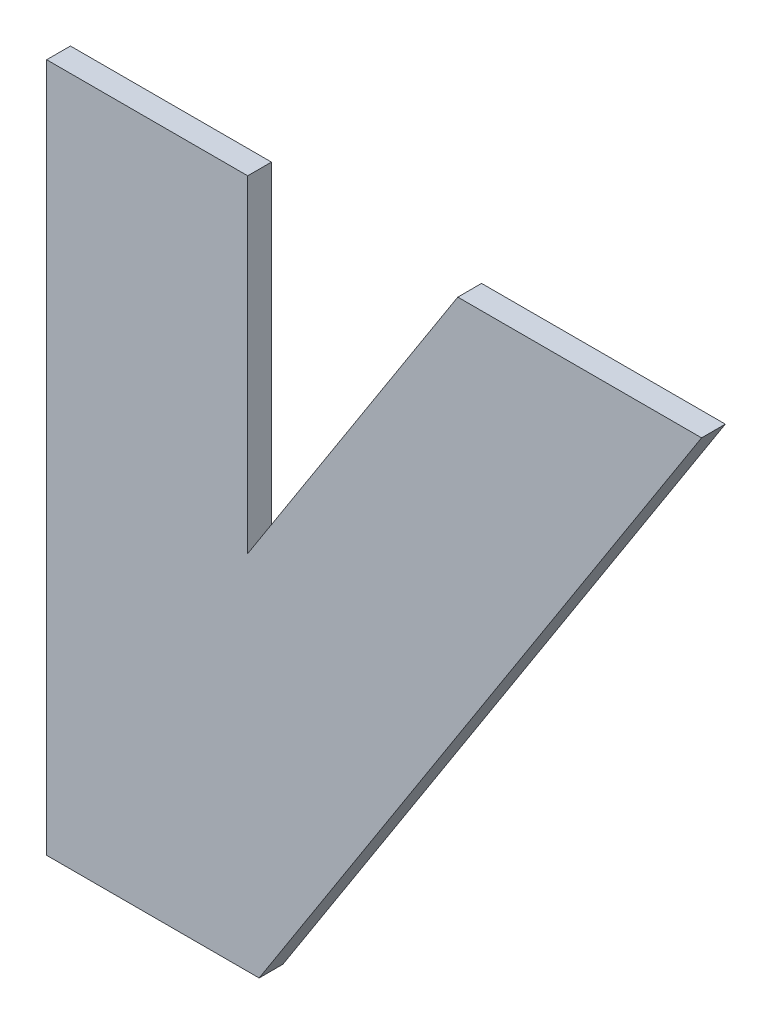
ISO-10303-21;
HEADER;
FILE_DESCRIPTION(('STEP AP214'),'2;1');
FILE_NAME('part.step','',(''),(''),'','','');
FILE_SCHEMA(('AUTOMOTIVE_DESIGN { 1 0 10303 214 1 1 1 1 }'));
ENDSEC;
DATA;
#1=APPLICATION_CONTEXT('core data for automotive mechanical design processes');
#2=APPLICATION_PROTOCOL_DEFINITION('international standard','automotive_design',2000,#1);
#3=PRODUCT_CONTEXT('',#1,'mechanical');
#4=PRODUCT('Part','Part','',(#3));
#5=PRODUCT_RELATED_PRODUCT_CATEGORY('part','',(#4));
#6=PRODUCT_DEFINITION_FORMATION('','',#4);
#7=PRODUCT_DEFINITION_CONTEXT('part definition',#1,'design');
#8=PRODUCT_DEFINITION('design','',#6,#7);
#9=PRODUCT_DEFINITION_SHAPE('','',#8);
#10=(LENGTH_UNIT() NAMED_UNIT(*) SI_UNIT(.MILLI.,.METRE.));
#11=(NAMED_UNIT(*) PLANE_ANGLE_UNIT() SI_UNIT($,.RADIAN.));
#12=(NAMED_UNIT(*) SI_UNIT($,.STERADIAN.) SOLID_ANGLE_UNIT());
#13=UNCERTAINTY_MEASURE_WITH_UNIT(LENGTH_MEASURE(1.E-05),#10,'distance_accuracy_value','');
#14=(GEOMETRIC_REPRESENTATION_CONTEXT(3) GLOBAL_UNCERTAINTY_ASSIGNED_CONTEXT((#13)) GLOBAL_UNIT_ASSIGNED_CONTEXT((#10,
#11,#12)) REPRESENTATION_CONTEXT('',''));
#15=CARTESIAN_POINT('',(0.,0.,0.));
#16=DIRECTION('',(0.,0.,1.));
#17=DIRECTION('',(1.,0.,0.));
#18=AXIS2_PLACEMENT_3D('',#15,#16,#17);
#19=CARTESIAN_POINT('',(-11.5384615384615,-15.,0.5));
#20=DIRECTION('',(0.,1.,0.));
#21=DIRECTION('',(0.,0.,1.));
#22=AXIS2_PLACEMENT_3D('',#19,#20,#21);
#23=PLANE('',#22);
#24=DIRECTION('',(1.,0.,0.));
#25=VECTOR('',#24,1.);
#26=CARTESIAN_POINT('',(-11.5384615384615,-15.,0.));
#27=LINE('',#26,#25);
#28=CARTESIAN_POINT('',(-11.5384615384615,-15.,0.));
#29=VERTEX_POINT('',#28);
#30=CARTESIAN_POINT('',(-7.06730769230767,-15.,0.));
#31=VERTEX_POINT('',#30);
#32=EDGE_CURVE('E140',#29,#31,#27,.T.);
#33=ORIENTED_EDGE('',*,*,#32,.T.);
#34=DIRECTION('',(0.,0.,-1.));
#35=VECTOR('',#34,1.);
#36=CARTESIAN_POINT('',(-7.06730769230767,-15.,0.5));
#37=LINE('',#36,#35);
#38=CARTESIAN_POINT('',(-7.06730769230767,-15.,0.5));
#39=VERTEX_POINT('',#38);
#40=EDGE_CURVE('E142',#39,#31,#37,.T.);
#41=ORIENTED_EDGE('',*,*,#40,.F.);
#42=DIRECTION('',(1.,0.,0.));
#43=VECTOR('',#42,1.);
#44=CARTESIAN_POINT('',(-11.5384615384615,-15.,0.5));
#45=LINE('',#44,#43);
#46=CARTESIAN_POINT('',(-11.5384615384615,-15.,0.5));
#47=VERTEX_POINT('',#46);
#48=EDGE_CURVE('E139',#47,#39,#45,.T.);
#49=ORIENTED_EDGE('',*,*,#48,.F.);
#50=DIRECTION('',(0.,0.,-1.));
#51=VECTOR('',#50,1.);
#52=CARTESIAN_POINT('',(-11.5384615384615,-15.,0.5));
#53=LINE('',#52,#51);
#54=EDGE_CURVE('E148',#47,#29,#53,.T.);
#55=ORIENTED_EDGE('',*,*,#54,.T.);
#56=EDGE_LOOP('',(#33,#41,#49,#55));
#57=FACE_BOUND('',#56,.T.);
#58=ADVANCED_FACE('F39',(#57),#23,.F.);
#59=CARTESIAN_POINT('',(0.,0.,0.5));
#60=DIRECTION('',(0.,0.,1.));
#61=DIRECTION('',(1.,0.,0.));
#62=AXIS2_PLACEMENT_3D('',#59,#60,#61);
#63=PLANE('',#62);
#64=DIRECTION('',(1.,0.,0.));
#65=VECTOR('',#64,1.);
#66=CARTESIAN_POINT('',(0.,-0.5,0.5));
#67=LINE('',#66,#65);
#68=CARTESIAN_POINT('',(-11.5384615384615,-0.5,0.5));
#69=VERTEX_POINT('',#68);
#70=CARTESIAN_POINT('',(-7.30769230769229,-0.5,0.5));
#71=VERTEX_POINT('',#70);
#72=EDGE_CURVE('E11',#69,#71,#67,.T.);
#73=ORIENTED_EDGE('',*,*,#72,.F.);
#74=DIRECTION('',(0.,-1.,0.));
#75=VECTOR('',#74,1.);
#76=CARTESIAN_POINT('',(-11.5384615384615,15.,0.5));
#77=LINE('',#76,#75);
#78=EDGE_CURVE('E124',#69,#47,#77,.T.);
#79=ORIENTED_EDGE('',*,*,#78,.T.);
#80=ORIENTED_EDGE('',*,*,#48,.T.);
#81=DIRECTION('',(0.540335095812375,0.841449929724539,0.));
#82=VECTOR('',#81,1.);
#83=CARTESIAN_POINT('',(-7.06730769230767,-15.,0.5));
#84=LINE('',#83,#82);
#85=CARTESIAN_POINT('',(2.24383324728964,-0.500000000000002,0.5));
#86=VERTEX_POINT('',#85);
#87=EDGE_CURVE('E106',#39,#86,#84,.T.);
#88=ORIENTED_EDGE('',*,*,#87,.T.);
#89=CARTESIAN_POINT('',(-2.88598089829632,-0.5,0.5));
#90=VERTEX_POINT('',#89);
#91=EDGE_CURVE('E51',#90,#86,#67,.T.);
#92=ORIENTED_EDGE('',*,*,#91,.F.);
#93=DIRECTION('',(-0.540335095812375,-0.841449929724539,0.));
#94=VECTOR('',#93,1.);
#95=CARTESIAN_POINT('',(7.06730769230771,15.,0.5));
#96=LINE('',#95,#94);
#97=CARTESIAN_POINT('',(-7.30769230769229,-7.38581730769231,0.5));
#98=VERTEX_POINT('',#97);
#99=EDGE_CURVE('E104',#90,#98,#96,.T.);
#100=ORIENTED_EDGE('',*,*,#99,.T.);
#101=DIRECTION('',(0.,1.,0.));
#102=VECTOR('',#101,1.);
#103=CARTESIAN_POINT('',(-7.30769230769229,-7.38581730769231,0.5));
#104=LINE('',#103,#102);
#105=EDGE_CURVE('E109',#98,#71,#104,.T.);
#106=ORIENTED_EDGE('',*,*,#105,.T.);
#107=EDGE_LOOP('',(#73,#79,#80,#88,#92,#100,#106));
#108=FACE_BOUND('',#107,.T.);
#109=ADVANCED_FACE('F103',(#108),#63,.T.);
#110=CARTESIAN_POINT('',(-7.06730769230767,-15.,0.5));
#111=DIRECTION('',(-0.841449929724539,0.540335095812375,0.));
#112=DIRECTION('',(-0.540335095812375,-0.841449929724539,0.));
#113=AXIS2_PLACEMENT_3D('',#110,#111,#112);
#114=PLANE('',#113);
#115=DIRECTION('',(0.540335095812375,0.841449929724539,0.));
#116=VECTOR('',#115,1.);
#117=CARTESIAN_POINT('',(-7.06730769230767,-15.,0.));
#118=LINE('',#117,#116);
#119=CARTESIAN_POINT('',(2.24383324728964,-0.499999999999999,0.));
#120=VERTEX_POINT('',#119);
#121=EDGE_CURVE('E116',#31,#120,#118,.T.);
#122=ORIENTED_EDGE('',*,*,#121,.T.);
#123=DIRECTION('',(0.,0.,1.));
#124=VECTOR('',#123,1.);
#125=CARTESIAN_POINT('',(2.24383324728964,-0.5,0.5));
#126=LINE('',#125,#124);
#127=EDGE_CURVE('E75',#120,#86,#126,.T.);
#128=ORIENTED_EDGE('',*,*,#127,.T.);
#129=ORIENTED_EDGE('',*,*,#87,.F.);
#130=ORIENTED_EDGE('',*,*,#40,.T.);
#131=EDGE_LOOP('',(#122,#128,#129,#130));
#132=FACE_BOUND('',#131,.T.);
#133=ADVANCED_FACE('F159',(#132),#114,.F.);
#134=CARTESIAN_POINT('',(-11.5384615384615,15.,0.5));
#135=DIRECTION('',(1.,0.,0.));
#136=DIRECTION('',(0.,0.,-1.));
#137=AXIS2_PLACEMENT_3D('',#134,#135,#136);
#138=PLANE('',#137);
#139=ORIENTED_EDGE('',*,*,#78,.F.);
#140=DIRECTION('',(0.,0.,-1.));
#141=VECTOR('',#140,1.);
#142=CARTESIAN_POINT('',(-11.5384615384615,-0.5,0.5));
#143=LINE('',#142,#141);
#144=CARTESIAN_POINT('',(-11.5384615384615,-0.5,0.));
#145=VERTEX_POINT('',#144);
#146=EDGE_CURVE('E127',#69,#145,#143,.T.);
#147=ORIENTED_EDGE('',*,*,#146,.T.);
#148=DIRECTION('',(0.,-1.,0.));
#149=VECTOR('',#148,1.);
#150=CARTESIAN_POINT('',(-11.5384615384615,15.,0.));
#151=LINE('',#150,#149);
#152=EDGE_CURVE('E130',#145,#29,#151,.T.);
#153=ORIENTED_EDGE('',*,*,#152,.T.);
#154=ORIENTED_EDGE('',*,*,#54,.F.);
#155=EDGE_LOOP('',(#139,#147,#153,#154));
#156=FACE_BOUND('',#155,.T.);
#157=ADVANCED_FACE('F162',(#156),#138,.F.);
#158=CARTESIAN_POINT('',(-7.30769230769229,-7.38581730769231,0.5));
#159=DIRECTION('',(-1.,0.,0.));
#160=DIRECTION('',(0.,0.,1.));
#161=AXIS2_PLACEMENT_3D('',#158,#159,#160);
#162=PLANE('',#161);
#163=DIRECTION('',(0.,1.,0.));
#164=VECTOR('',#163,1.);
#165=CARTESIAN_POINT('',(-7.30769230769229,-7.38581730769231,0.));
#166=LINE('',#165,#164);
#167=CARTESIAN_POINT('',(-7.30769230769229,-7.38581730769231,0.));
#168=VERTEX_POINT('',#167);
#169=CARTESIAN_POINT('',(-7.30769230769229,-0.5,0.));
#170=VERTEX_POINT('',#169);
#171=EDGE_CURVE('E129',#168,#170,#166,.T.);
#172=ORIENTED_EDGE('',*,*,#171,.T.);
#173=DIRECTION('',(0.,0.,1.));
#174=VECTOR('',#173,1.);
#175=CARTESIAN_POINT('',(-7.30769230769229,-0.5,0.5));
#176=LINE('',#175,#174);
#177=EDGE_CURVE('E59',#170,#71,#176,.T.);
#178=ORIENTED_EDGE('',*,*,#177,.T.);
#179=ORIENTED_EDGE('',*,*,#105,.F.);
#180=DIRECTION('',(0.,0.,-1.));
#181=VECTOR('',#180,1.);
#182=CARTESIAN_POINT('',(-7.30769230769229,-7.38581730769231,0.5));
#183=LINE('',#182,#181);
#184=EDGE_CURVE('E112',#98,#168,#183,.T.);
#185=ORIENTED_EDGE('',*,*,#184,.T.);
#186=EDGE_LOOP('',(#172,#178,#179,#185));
#187=FACE_BOUND('',#186,.T.);
#188=ADVANCED_FACE('F120',(#187),#162,.F.);
#189=CARTESIAN_POINT('',(7.06730769230771,15.,0.5));
#190=DIRECTION('',(0.841449929724539,-0.540335095812375,0.));
#191=DIRECTION('',(0.540335095812375,0.841449929724539,0.));
#192=AXIS2_PLACEMENT_3D('',#189,#190,#191);
#193=PLANE('',#192);
#194=ORIENTED_EDGE('',*,*,#99,.F.);
#195=DIRECTION('',(0.,0.,-1.));
#196=VECTOR('',#195,1.);
#197=CARTESIAN_POINT('',(-2.88598089829632,-0.5,0.5));
#198=LINE('',#197,#196);
#199=CARTESIAN_POINT('',(-2.88598089829632,-0.500000000000002,0.));
#200=VERTEX_POINT('',#199);
#201=EDGE_CURVE('E117',#90,#200,#198,.T.);
#202=ORIENTED_EDGE('',*,*,#201,.T.);
#203=DIRECTION('',(-0.540335095812375,-0.841449929724539,0.));
#204=VECTOR('',#203,1.);
#205=CARTESIAN_POINT('',(7.06730769230771,15.,0.));
#206=LINE('',#205,#204);
#207=EDGE_CURVE('E82',#200,#168,#206,.T.);
#208=ORIENTED_EDGE('',*,*,#207,.T.);
#209=ORIENTED_EDGE('',*,*,#184,.F.);
#210=EDGE_LOOP('',(#194,#202,#208,#209));
#211=FACE_BOUND('',#210,.T.);
#212=ADVANCED_FACE('F115',(#211),#193,.F.);
#213=CARTESIAN_POINT('',(0.,0.,0.));
#214=DIRECTION('',(0.,0.,1.));
#215=DIRECTION('',(1.,0.,0.));
#216=AXIS2_PLACEMENT_3D('',#213,#214,#215);
#217=PLANE('',#216);
#218=DIRECTION('',(-1.,0.,0.));
#219=VECTOR('',#218,1.);
#220=CARTESIAN_POINT('',(-17.,-0.5,0.));
#221=LINE('',#220,#219);
#222=EDGE_CURVE('E43',#120,#200,#221,.T.);
#223=ORIENTED_EDGE('',*,*,#222,.F.);
#224=ORIENTED_EDGE('',*,*,#121,.F.);
#225=ORIENTED_EDGE('',*,*,#32,.F.);
#226=ORIENTED_EDGE('',*,*,#152,.F.);
#227=DIRECTION('',(-1.,0.,0.));
#228=VECTOR('',#227,1.);
#229=CARTESIAN_POINT('',(-17.,-0.5,0.));
#230=LINE('',#229,#228);
#231=EDGE_CURVE('E47',#170,#145,#230,.T.);
#232=ORIENTED_EDGE('',*,*,#231,.F.);
#233=ORIENTED_EDGE('',*,*,#171,.F.);
#234=ORIENTED_EDGE('',*,*,#207,.F.);
#235=EDGE_LOOP('',(#223,#224,#225,#226,#232,#233,#234));
#236=FACE_BOUND('',#235,.T.);
#237=ADVANCED_FACE('F41',(#236),#217,.F.);
#238=CARTESIAN_POINT('',(-17.,-0.5,1.));
#239=DIRECTION('',(0.,-1.,0.));
#240=DIRECTION('',(0.,0.,-1.));
#241=AXIS2_PLACEMENT_3D('',#238,#239,#240);
#242=PLANE('',#241);
#243=ORIENTED_EDGE('',*,*,#91,.T.);
#244=ORIENTED_EDGE('',*,*,#127,.F.);
#245=ORIENTED_EDGE('',*,*,#222,.T.);
#246=ORIENTED_EDGE('',*,*,#201,.F.);
#247=EDGE_LOOP('',(#243,#244,#245,#246));
#248=FACE_BOUND('',#247,.T.);
#249=ADVANCED_FACE('F184',(#248),#242,.F.);
#250=ORIENTED_EDGE('',*,*,#231,.T.);
#251=ORIENTED_EDGE('',*,*,#146,.F.);
#252=ORIENTED_EDGE('',*,*,#72,.T.);
#253=ORIENTED_EDGE('',*,*,#177,.F.);
#254=EDGE_LOOP('',(#250,#251,#252,#253));
#255=FACE_BOUND('',#254,.T.);
#256=ADVANCED_FACE('F189',(#255),#242,.F.);
#257=CLOSED_SHELL('',(#58,#109,#133,#157,#188,#212,#237,#249,#256));
#258=MANIFOLD_SOLID_BREP('B2',#257);
#259=ADVANCED_BREP_SHAPE_REPRESENTATION('',(#18,#258),#14);
#260=SHAPE_DEFINITION_REPRESENTATION(#9,#259);
ENDSEC;
END-ISO-10303-21;
